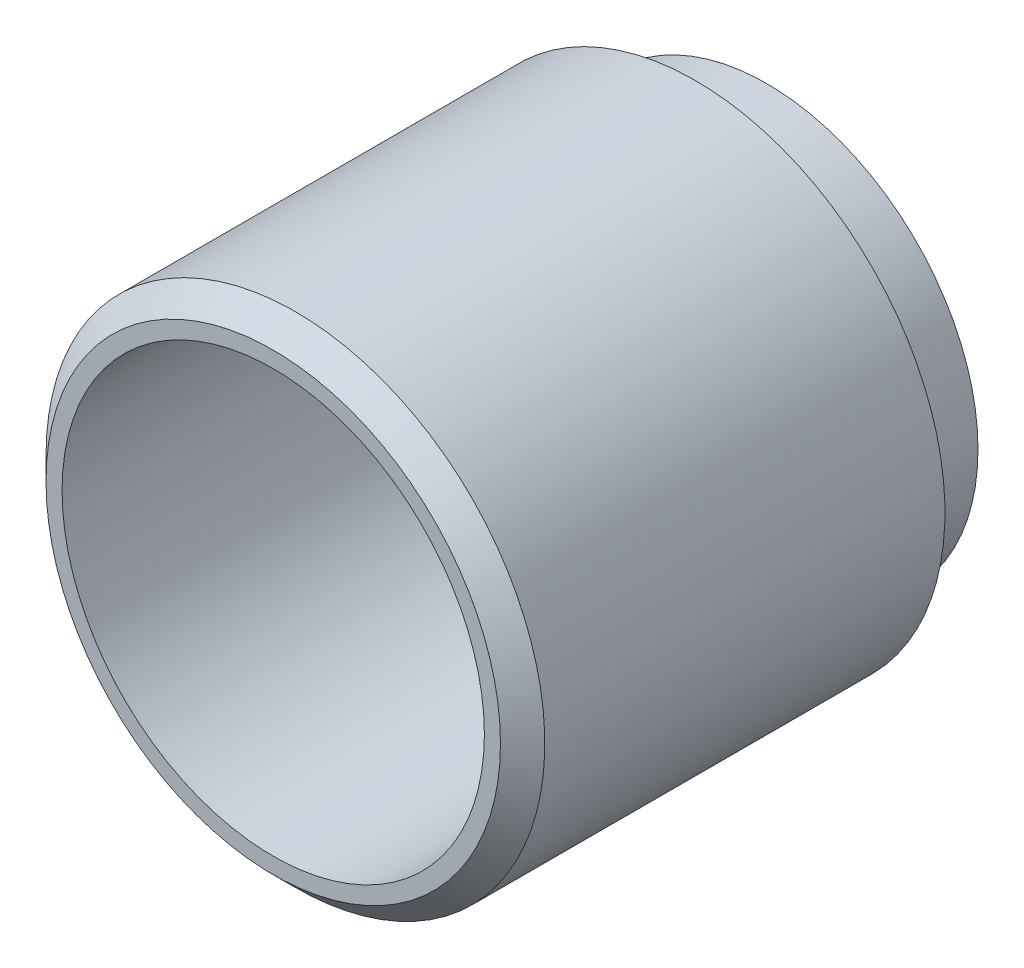
ISO-10303-21;
HEADER;
FILE_DESCRIPTION(('STEP AP214'),'2;1');
FILE_NAME('part.step','',(''),(''),'','','');
FILE_SCHEMA(('AUTOMOTIVE_DESIGN { 1 0 10303 214 1 1 1 1 }'));
ENDSEC;
DATA;
#1=APPLICATION_CONTEXT('core data for automotive mechanical design processes');
#2=APPLICATION_PROTOCOL_DEFINITION('international standard','automotive_design',2000,#1);
#3=PRODUCT_CONTEXT('',#1,'mechanical');
#4=PRODUCT('Part','Part','',(#3));
#5=PRODUCT_RELATED_PRODUCT_CATEGORY('part','',(#4));
#6=PRODUCT_DEFINITION_FORMATION('','',#4);
#7=PRODUCT_DEFINITION_CONTEXT('part definition',#1,'design');
#8=PRODUCT_DEFINITION('design','',#6,#7);
#9=PRODUCT_DEFINITION_SHAPE('','',#8);
#10=(LENGTH_UNIT() NAMED_UNIT(*) SI_UNIT(.MILLI.,.METRE.));
#11=(NAMED_UNIT(*) PLANE_ANGLE_UNIT() SI_UNIT($,.RADIAN.));
#12=(NAMED_UNIT(*) SI_UNIT($,.STERADIAN.) SOLID_ANGLE_UNIT());
#13=UNCERTAINTY_MEASURE_WITH_UNIT(LENGTH_MEASURE(1.E-05),#10,'distance_accuracy_value','');
#14=(GEOMETRIC_REPRESENTATION_CONTEXT(3) GLOBAL_UNCERTAINTY_ASSIGNED_CONTEXT((#13)) GLOBAL_UNIT_ASSIGNED_CONTEXT((#10,
#11,#12)) REPRESENTATION_CONTEXT('',''));
#15=CARTESIAN_POINT('',(0.,0.,0.));
#16=DIRECTION('',(0.,0.,1.));
#17=DIRECTION('',(1.,0.,0.));
#18=AXIS2_PLACEMENT_3D('',#15,#16,#17);
#19=CARTESIAN_POINT('',(-70.,40.,-6.43143388300519));
#20=DIRECTION('',(0.,0.,1.));
#21=DIRECTION('',(1.,0.,0.));
#22=AXIS2_PLACEMENT_3D('',#19,#20,#21);
#23=CYLINDRICAL_SURFACE('',#22,19.05);
#24=CARTESIAN_POINT('',(-70.,40.,-6.43143388300519));
#25=DIRECTION('',(0.,0.,1.));
#26=DIRECTION('',(1.,0.,0.));
#27=AXIS2_PLACEMENT_3D('',#24,#25,#26);
#28=CIRCLE('',#27,19.05);
#29=CARTESIAN_POINT('',(-50.95,40.,-6.43143388300519));
#30=VERTEX_POINT('',#29);
#31=EDGE_CURVE('E11',#30,#30,#28,.T.);
#32=ORIENTED_EDGE('',*,*,#31,.T.);
#33=EDGE_LOOP('',(#32));
#34=FACE_BOUND('',#33,.T.);
#35=CARTESIAN_POINT('',(-70.,40.,0.));
#36=DIRECTION('',(0.,0.,1.));
#37=DIRECTION('',(1.,0.,0.));
#38=AXIS2_PLACEMENT_3D('',#35,#36,#37);
#39=CIRCLE('',#38,19.05);
#40=CARTESIAN_POINT('',(-50.95,40.,0.));
#41=VERTEX_POINT('',#40);
#42=EDGE_CURVE('E42',#41,#41,#39,.T.);
#43=ORIENTED_EDGE('',*,*,#42,.F.);
#44=EDGE_LOOP('',(#43));
#45=FACE_BOUND('',#44,.T.);
#46=ADVANCED_FACE('F39',(#34,#45),#23,.T.);
#47=CARTESIAN_POINT('',(-70.,40.,-6.43143388300519));
#48=DIRECTION('',(0.,0.,1.));
#49=DIRECTION('',(1.,0.,0.));
#50=AXIS2_PLACEMENT_3D('',#47,#48,#49);
#51=PLANE('',#50);
#52=CARTESIAN_POINT('',(-70.,40.,-6.43143388300519));
#53=DIRECTION('',(0.,0.,1.));
#54=DIRECTION('',(1.,0.,0.));
#55=AXIS2_PLACEMENT_3D('',#52,#53,#54);
#56=CIRCLE('',#55,15.875);
#57=CARTESIAN_POINT('',(-54.125,40.,-6.43143388300519));
#58=VERTEX_POINT('',#57);
#59=EDGE_CURVE('E49',#58,#58,#56,.T.);
#60=ORIENTED_EDGE('',*,*,#59,.T.);
#61=EDGE_LOOP('',(#60));
#62=FACE_BOUND('',#61,.T.);
#63=ORIENTED_EDGE('',*,*,#31,.F.);
#64=EDGE_LOOP('',(#63));
#65=FACE_BOUND('',#64,.T.);
#66=ADVANCED_FACE('F57',(#62,#65),#51,.F.);
#67=CARTESIAN_POINT('',(-70.,40.,0.));
#68=DIRECTION('',(0.,0.,1.));
#69=DIRECTION('',(1.,0.,0.));
#70=AXIS2_PLACEMENT_3D('',#67,#68,#69);
#71=PLANE('',#70);
#72=CARTESIAN_POINT('',(-70.,40.,0.));
#73=DIRECTION('',(0.,0.,1.));
#74=DIRECTION('',(1.,0.,0.));
#75=AXIS2_PLACEMENT_3D('',#72,#73,#74);
#76=CIRCLE('',#75,15.875);
#77=CARTESIAN_POINT('',(-54.125,40.,0.));
#78=VERTEX_POINT('',#77);
#79=EDGE_CURVE('E51',#78,#78,#76,.T.);
#80=ORIENTED_EDGE('',*,*,#79,.F.);
#81=EDGE_LOOP('',(#80));
#82=FACE_BOUND('',#81,.T.);
#83=ORIENTED_EDGE('',*,*,#42,.T.);
#84=EDGE_LOOP('',(#83));
#85=FACE_BOUND('',#84,.T.);
#86=ADVANCED_FACE('F63',(#82,#85),#71,.T.);
#87=CARTESIAN_POINT('',(-70.,40.,-6.43143388300519));
#88=DIRECTION('',(0.,0.,1.));
#89=DIRECTION('',(1.,0.,0.));
#90=AXIS2_PLACEMENT_3D('',#87,#88,#89);
#91=CYLINDRICAL_SURFACE('',#90,15.875);
#92=ORIENTED_EDGE('',*,*,#59,.F.);
#93=EDGE_LOOP('',(#92));
#94=FACE_BOUND('',#93,.T.);
#95=ORIENTED_EDGE('',*,*,#79,.T.);
#96=EDGE_LOOP('',(#95));
#97=FACE_BOUND('',#96,.T.);
#98=ADVANCED_FACE('F60',(#94,#97),#91,.F.);
#99=CLOSED_SHELL('',(#46,#66,#86,#98));
#100=MANIFOLD_SOLID_BREP('B2',#99);
#101=CARTESIAN_POINT('',(-70.,40.,38.1));
#102=DIRECTION('',(0.,0.,1.));
#103=DIRECTION('',(1.,0.,0.));
#104=AXIS2_PLACEMENT_3D('',#101,#102,#103);
#105=PLANE('',#104);
#106=CARTESIAN_POINT('',(-70.,40.,38.1));
#107=DIRECTION('',(0.,0.,1.));
#108=DIRECTION('',(1.,0.,0.));
#109=AXIS2_PLACEMENT_3D('',#106,#107,#108);
#110=CIRCLE('',#109,20.5);
#111=CARTESIAN_POINT('',(-49.5,40.,38.1));
#112=VERTEX_POINT('',#111);
#113=EDGE_CURVE('E108',#112,#112,#110,.T.);
#114=ORIENTED_EDGE('',*,*,#113,.T.);
#115=EDGE_LOOP('',(#114));
#116=FACE_BOUND('',#115,.T.);
#117=CARTESIAN_POINT('',(-70.,40.,38.1));
#118=DIRECTION('',(0.,0.,1.));
#119=DIRECTION('',(1.,0.,0.));
#120=AXIS2_PLACEMENT_3D('',#117,#118,#119);
#121=CIRCLE('',#120,19.05);
#122=CARTESIAN_POINT('',(-89.05,40.,38.1));
#123=VERTEX_POINT('',#122);
#124=EDGE_CURVE('E116',#123,#123,#121,.T.);
#125=ORIENTED_EDGE('',*,*,#124,.F.);
#126=EDGE_LOOP('',(#125));
#127=FACE_BOUND('',#126,.T.);
#128=ADVANCED_FACE('F101',(#116,#127),#105,.T.);
#129=CARTESIAN_POINT('',(-70.,40.,0.));
#130=DIRECTION('',(0.,0.,1.));
#131=DIRECTION('',(1.,0.,0.));
#132=AXIS2_PLACEMENT_3D('',#129,#130,#131);
#133=PLANE('',#132);
#134=CARTESIAN_POINT('',(-70.,40.,0.));
#135=DIRECTION('',(0.,0.,1.));
#136=DIRECTION('',(1.,0.,0.));
#137=AXIS2_PLACEMENT_3D('',#134,#135,#136);
#138=CIRCLE('',#137,22.5);
#139=CARTESIAN_POINT('',(-92.5,40.,0.));
#140=VERTEX_POINT('',#139);
#141=EDGE_CURVE('E112',#140,#140,#138,.T.);
#142=ORIENTED_EDGE('',*,*,#141,.F.);
#143=EDGE_LOOP('',(#142));
#144=FACE_BOUND('',#143,.T.);
#145=CARTESIAN_POINT('',(-70.,40.,0.));
#146=DIRECTION('',(0.,0.,1.));
#147=DIRECTION('',(1.,0.,0.));
#148=AXIS2_PLACEMENT_3D('',#145,#146,#147);
#149=CIRCLE('',#148,19.05);
#150=CARTESIAN_POINT('',(-89.05,40.,0.));
#151=VERTEX_POINT('',#150);
#152=EDGE_CURVE('E119',#151,#151,#149,.T.);
#153=ORIENTED_EDGE('',*,*,#152,.T.);
#154=EDGE_LOOP('',(#153));
#155=FACE_BOUND('',#154,.T.);
#156=ADVANCED_FACE('F129',(#144,#155),#133,.F.);
#157=CARTESIAN_POINT('',(-70.,40.,38.1));
#158=DIRECTION('',(0.,0.,-1.));
#159=DIRECTION('',(-1.,0.,0.));
#160=AXIS2_PLACEMENT_3D('',#157,#158,#159);
#161=CYLINDRICAL_SURFACE('',#160,22.5);
#162=CARTESIAN_POINT('',(-70.,40.,36.1));
#163=DIRECTION('',(0.,0.,1.));
#164=DIRECTION('',(1.,0.,0.));
#165=AXIS2_PLACEMENT_3D('',#162,#163,#164);
#166=CIRCLE('',#165,22.5);
#167=CARTESIAN_POINT('',(-92.5,40.,36.1));
#168=VERTEX_POINT('',#167);
#169=EDGE_CURVE('E38',#168,#168,#166,.F.);
#170=CARTESIAN_POINT('',(-92.5,40.,36.1));
#171=CARTESIAN_POINT('',(-92.5,40.,35.7239583333333));
#172=CARTESIAN_POINT('',(-92.5,40.,35.3479166666667));
#173=CARTESIAN_POINT('',(-92.5,40.,34.5958333333333));
#174=CARTESIAN_POINT('',(-92.5,40.,34.2197916666667));
#175=CARTESIAN_POINT('',(-92.5,40.,33.4677083333334));
#176=CARTESIAN_POINT('',(-92.5,40.,33.0916666666667));
#177=CARTESIAN_POINT('',(-92.5,40.,32.3395833333333));
#178=CARTESIAN_POINT('',(-92.5,40.,31.9635416666667));
#179=CARTESIAN_POINT('',(-92.5,40.,31.2114583333334));
#180=CARTESIAN_POINT('',(-92.5,40.,30.8354166666667));
#181=CARTESIAN_POINT('',(-92.5,40.,30.0833333333333));
#182=CARTESIAN_POINT('',(-92.5,40.,29.7072916666667));
#183=CARTESIAN_POINT('',(-92.5,40.,28.9552083333333));
#184=CARTESIAN_POINT('',(-92.5,40.,28.5791666666667));
#185=CARTESIAN_POINT('',(-92.5,40.,27.8270833333333));
#186=CARTESIAN_POINT('',(-92.5,40.,27.4510416666667));
#187=CARTESIAN_POINT('',(-92.5,40.,26.6989583333333));
#188=CARTESIAN_POINT('',(-92.5,40.,26.3229166666667));
#189=CARTESIAN_POINT('',(-92.5,40.,25.5708333333333));
#190=CARTESIAN_POINT('',(-92.5,40.,25.1947916666667));
#191=CARTESIAN_POINT('',(-92.5,40.,24.4427083333333));
#192=CARTESIAN_POINT('',(-92.5,40.,24.0666666666667));
#193=CARTESIAN_POINT('',(-92.5,40.,23.3145833333333));
#194=CARTESIAN_POINT('',(-92.5,40.,22.9385416666667));
#195=CARTESIAN_POINT('',(-92.5,40.,22.1864583333333));
#196=CARTESIAN_POINT('',(-92.5,40.,21.8104166666667));
#197=CARTESIAN_POINT('',(-92.5,40.,21.0583333333333));
#198=CARTESIAN_POINT('',(-92.5,40.,20.6822916666667));
#199=CARTESIAN_POINT('',(-92.5,40.,19.9302083333333));
#200=CARTESIAN_POINT('',(-92.5,40.,19.5541666666667));
#201=CARTESIAN_POINT('',(-92.5,40.,18.8020833333333));
#202=CARTESIAN_POINT('',(-92.5,40.,18.4260416666667));
#203=CARTESIAN_POINT('',(-92.5,40.,17.6739583333333));
#204=CARTESIAN_POINT('',(-92.5,40.,17.2979166666667));
#205=CARTESIAN_POINT('',(-92.5,40.,16.5458333333333));
#206=CARTESIAN_POINT('',(-92.5,40.,16.1697916666667));
#207=CARTESIAN_POINT('',(-92.5,40.,15.4177083333333));
#208=CARTESIAN_POINT('',(-92.5,40.,15.0416666666667));
#209=CARTESIAN_POINT('',(-92.5,40.,14.2895833333333));
#210=CARTESIAN_POINT('',(-92.5,40.,13.9135416666667));
#211=CARTESIAN_POINT('',(-92.5,40.,13.1614583333333));
#212=CARTESIAN_POINT('',(-92.5,40.,12.7854166666667));
#213=CARTESIAN_POINT('',(-92.5,40.,12.0333333333333));
#214=CARTESIAN_POINT('',(-92.5,40.,11.6572916666667));
#215=CARTESIAN_POINT('',(-92.5,40.,10.9052083333333));
#216=CARTESIAN_POINT('',(-92.5,40.,10.5291666666667));
#217=CARTESIAN_POINT('',(-92.5,40.,9.77708333333334));
#218=CARTESIAN_POINT('',(-92.5,40.,9.40104166666667));
#219=CARTESIAN_POINT('',(-92.5,40.,8.64895833333334));
#220=CARTESIAN_POINT('',(-92.5,40.,8.27291666666667));
#221=CARTESIAN_POINT('',(-92.5,40.,7.52083333333334));
#222=CARTESIAN_POINT('',(-92.5,40.,7.14479166666667));
#223=CARTESIAN_POINT('',(-92.5,40.,6.39270833333334));
#224=CARTESIAN_POINT('',(-92.5,40.,6.01666666666667));
#225=CARTESIAN_POINT('',(-92.5,40.,5.26458333333334));
#226=CARTESIAN_POINT('',(-92.5,40.,4.88854166666667));
#227=CARTESIAN_POINT('',(-92.5,40.,4.13645833333334));
#228=CARTESIAN_POINT('',(-92.5,40.,3.76041666666667));
#229=CARTESIAN_POINT('',(-92.5,40.,3.00833333333334));
#230=CARTESIAN_POINT('',(-92.5,40.,2.63229166666667));
#231=CARTESIAN_POINT('',(-92.5,40.,1.88020833333333));
#232=CARTESIAN_POINT('',(-92.5,40.,1.50416666666667));
#233=CARTESIAN_POINT('',(-92.5,40.,0.752083333333334));
#234=CARTESIAN_POINT('',(-92.5,40.,0.376041666666667));
#235=CARTESIAN_POINT('',(-92.5,40.,0.));
#236=B_SPLINE_CURVE_WITH_KNOTS('',3,(#170,#171,#172,#173,#174,#175,#176,#177,#178,#179,#180,
#181,#182,#183,#184,#185,#186,#187,#188,#189,#190,#191,#192,#193,#194,#195,#196,#197,#198,#199,
#200,#201,#202,#203,#204,#205,#206,#207,#208,#209,#210,#211,#212,#213,#214,#215,#216,#217,#218,
#219,#220,#221,#222,#223,#224,#225,#226,#227,#228,#229,#230,#231,#232,#233,#234,#235),
.UNSPECIFIED.,.F.,.F.,(4,2,2,2,2,2,2,2,2,2,2,2,2,2,2,2,2,2,2,2,2,2,2,2,2,2,2,2,2,2,2,2,4),(0.,
1.128125,2.25624999999999,3.384375,4.5125,5.640625,6.76875,7.896875,9.025,10.153125,11.28125,
12.409375,13.5375,14.665625,15.79375,16.921875,18.05,19.178125,20.30625,21.434375,22.5625,
23.690625,24.81875,25.946875,27.075,28.203125,29.33125,30.459375,31.5875,32.715625,33.84375,
34.971875,36.1),.UNSPECIFIED.);
#237=EDGE_CURVE('BSEAM134',#168,#140,#236,.T.);
#238=ORIENTED_EDGE('',*,*,#169,.T.);
#239=ORIENTED_EDGE('',*,*,#141,.T.);
#240=ORIENTED_EDGE('',*,*,#237,.T.);
#241=ORIENTED_EDGE('',*,*,#237,.F.);
#242=EDGE_LOOP('',(#238,#240,#239,#241));
#243=FACE_BOUND('',#242,.T.);
#244=ADVANCED_FACE('F134',(#243),#161,.T.);
#245=CARTESIAN_POINT('',(-70.,40.,38.1));
#246=DIRECTION('',(0.,0.,-1.));
#247=DIRECTION('',(-1.,0.,0.));
#248=AXIS2_PLACEMENT_3D('',#245,#246,#247);
#249=CYLINDRICAL_SURFACE('',#248,19.05);
#250=CARTESIAN_POINT('',(-89.05,40.,38.1));
#251=CARTESIAN_POINT('',(-89.05,40.,37.703125));
#252=CARTESIAN_POINT('',(-89.05,40.,37.30625));
#253=CARTESIAN_POINT('',(-89.05,40.,36.5125));
#254=CARTESIAN_POINT('',(-89.05,40.,36.115625));
#255=CARTESIAN_POINT('',(-89.05,40.,35.321875));
#256=CARTESIAN_POINT('',(-89.05,40.,34.925));
#257=CARTESIAN_POINT('',(-89.05,40.,34.13125));
#258=CARTESIAN_POINT('',(-89.05,40.,33.734375));
#259=CARTESIAN_POINT('',(-89.05,40.,32.940625));
#260=CARTESIAN_POINT('',(-89.05,40.,32.54375));
#261=CARTESIAN_POINT('',(-89.05,40.,31.75));
#262=CARTESIAN_POINT('',(-89.05,40.,31.353125));
#263=CARTESIAN_POINT('',(-89.05,40.,30.559375));
#264=CARTESIAN_POINT('',(-89.05,40.,30.1625));
#265=CARTESIAN_POINT('',(-89.05,40.,29.36875));
#266=CARTESIAN_POINT('',(-89.05,40.,28.971875));
#267=CARTESIAN_POINT('',(-89.05,40.,28.178125));
#268=CARTESIAN_POINT('',(-89.05,40.,27.78125));
#269=CARTESIAN_POINT('',(-89.05,40.,26.9875));
#270=CARTESIAN_POINT('',(-89.05,40.,26.590625));
#271=CARTESIAN_POINT('',(-89.05,40.,25.796875));
#272=CARTESIAN_POINT('',(-89.05,40.,25.4));
#273=CARTESIAN_POINT('',(-89.05,40.,24.60625));
#274=CARTESIAN_POINT('',(-89.05,40.,24.209375));
#275=CARTESIAN_POINT('',(-89.05,40.,23.415625));
#276=CARTESIAN_POINT('',(-89.05,40.,23.01875));
#277=CARTESIAN_POINT('',(-89.05,40.,22.225));
#278=CARTESIAN_POINT('',(-89.05,40.,21.828125));
#279=CARTESIAN_POINT('',(-89.05,40.,21.034375));
#280=CARTESIAN_POINT('',(-89.05,40.,20.6375));
#281=CARTESIAN_POINT('',(-89.05,40.,19.84375));
#282=CARTESIAN_POINT('',(-89.05,40.,19.446875));
#283=CARTESIAN_POINT('',(-89.05,40.,18.653125));
#284=CARTESIAN_POINT('',(-89.05,40.,18.25625));
#285=CARTESIAN_POINT('',(-89.05,40.,17.4625));
#286=CARTESIAN_POINT('',(-89.05,40.,17.065625));
#287=CARTESIAN_POINT('',(-89.05,40.,16.271875));
#288=CARTESIAN_POINT('',(-89.05,40.,15.875));
#289=CARTESIAN_POINT('',(-89.05,40.,15.08125));
#290=CARTESIAN_POINT('',(-89.05,40.,14.684375));
#291=CARTESIAN_POINT('',(-89.05,40.,13.890625));
#292=CARTESIAN_POINT('',(-89.05,40.,13.49375));
#293=CARTESIAN_POINT('',(-89.05,40.,12.7));
#294=CARTESIAN_POINT('',(-89.05,40.,12.303125));
#295=CARTESIAN_POINT('',(-89.05,40.,11.509375));
#296=CARTESIAN_POINT('',(-89.05,40.,11.1125));
#297=CARTESIAN_POINT('',(-89.05,40.,10.31875));
#298=CARTESIAN_POINT('',(-89.05,40.,9.92187499999999));
#299=CARTESIAN_POINT('',(-89.05,40.,9.128125));
#300=CARTESIAN_POINT('',(-89.05,40.,8.73124999999999));
#301=CARTESIAN_POINT('',(-89.05,40.,7.93749999999999));
#302=CARTESIAN_POINT('',(-89.05,40.,7.54062499999999));
#303=CARTESIAN_POINT('',(-89.05,40.,6.746875));
#304=CARTESIAN_POINT('',(-89.05,40.,6.35));
#305=CARTESIAN_POINT('',(-89.05,40.,5.55625));
#306=CARTESIAN_POINT('',(-89.05,40.,5.159375));
#307=CARTESIAN_POINT('',(-89.05,40.,4.365625));
#308=CARTESIAN_POINT('',(-89.05,40.,3.96875));
#309=CARTESIAN_POINT('',(-89.05,40.,3.175));
#310=CARTESIAN_POINT('',(-89.05,40.,2.778125));
#311=CARTESIAN_POINT('',(-89.05,40.,1.984375));
#312=CARTESIAN_POINT('',(-89.05,40.,1.5875));
#313=CARTESIAN_POINT('',(-89.05,40.,0.79375));
#314=CARTESIAN_POINT('',(-89.05,40.,0.396875));
#315=CARTESIAN_POINT('',(-89.05,40.,0.));
#316=B_SPLINE_CURVE_WITH_KNOTS('',3,(#250,#251,#252,#253,#254,#255,#256,#257,#258,#259,#260,
#261,#262,#263,#264,#265,#266,#267,#268,#269,#270,#271,#272,#273,#274,#275,#276,#277,#278,#279,
#280,#281,#282,#283,#284,#285,#286,#287,#288,#289,#290,#291,#292,#293,#294,#295,#296,#297,#298,
#299,#300,#301,#302,#303,#304,#305,#306,#307,#308,#309,#310,#311,#312,#313,#314,#315),
.UNSPECIFIED.,.F.,.F.,(4,2,2,2,2,2,2,2,2,2,2,2,2,2,2,2,2,2,2,2,2,2,2,2,2,2,2,2,2,2,2,2,4),(0.,
1.190625,2.38125,3.571875,4.7625,5.953125,7.14375,8.334375,9.52500000000001,10.715625,11.90625,
13.096875,14.2875,15.478125,16.66875,17.859375,19.05,20.240625,21.43125,22.621875,23.8125,
25.003125,26.19375,27.384375,28.575,29.765625,30.95625,32.146875,33.3375,34.528125,35.71875,
36.909375,38.1),.UNSPECIFIED.);
#317=EDGE_CURVE('BSEAM125',#123,#151,#316,.T.);
#318=ORIENTED_EDGE('',*,*,#124,.T.);
#319=ORIENTED_EDGE('',*,*,#152,.F.);
#320=ORIENTED_EDGE('',*,*,#317,.T.);
#321=ORIENTED_EDGE('',*,*,#317,.F.);
#322=EDGE_LOOP('',(#318,#320,#319,#321));
#323=FACE_BOUND('',#322,.T.);
#324=ADVANCED_FACE('F125',(#323),#249,.F.);
#325=CARTESIAN_POINT('',(-70.,40.,38.1));
#326=DIRECTION('',(0.,0.,-1.));
#327=DIRECTION('',(-1.,0.,0.));
#328=AXIS2_PLACEMENT_3D('',#325,#326,#327);
#329=CONICAL_SURFACE('',#328,20.5,0.785398163397445);
#330=ORIENTED_EDGE('',*,*,#169,.F.);
#331=EDGE_LOOP('',(#330));
#332=FACE_BOUND('',#331,.T.);
#333=ORIENTED_EDGE('',*,*,#113,.F.);
#334=EDGE_LOOP('',(#333));
#335=FACE_BOUND('',#334,.T.);
#336=ADVANCED_FACE('F103',(#332,#335),#329,.T.);
#337=CLOSED_SHELL('',(#128,#156,#244,#324,#336));
#338=MANIFOLD_SOLID_BREP('B6',#337);
#339=ADVANCED_BREP_SHAPE_REPRESENTATION('',(#18,#100,#338),#14);
#340=SHAPE_DEFINITION_REPRESENTATION(#9,#339);
ENDSEC;
END-ISO-10303-21;
